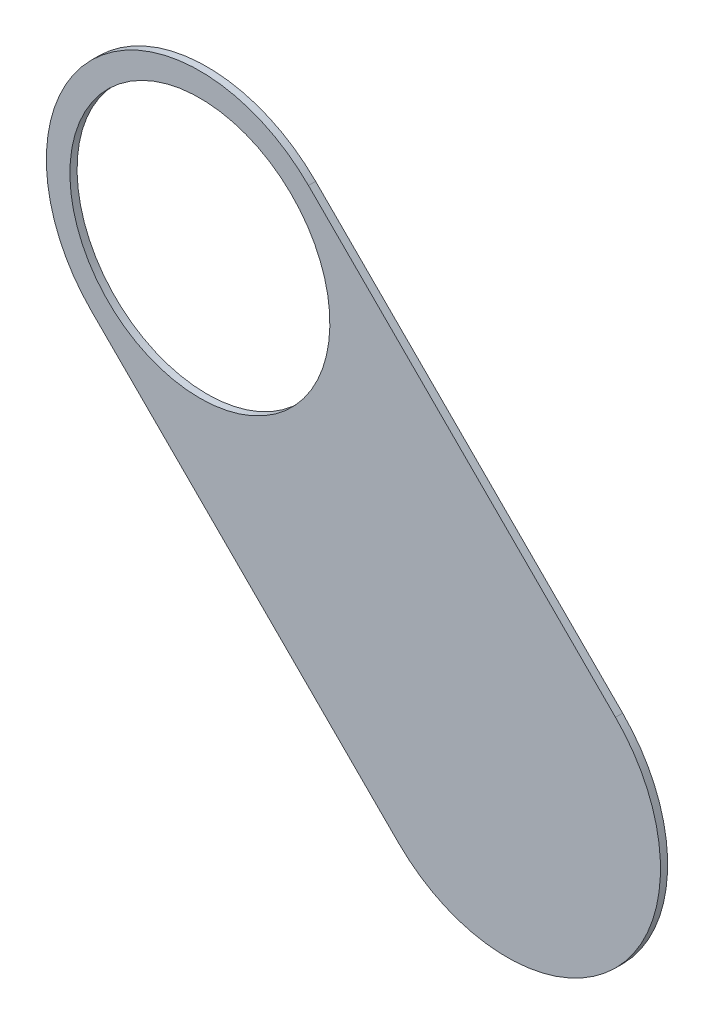
ISO-10303-21;
HEADER;
FILE_DESCRIPTION(('STEP AP214'),'2;1');
FILE_NAME('part.step','',(''),(''),'','','');
FILE_SCHEMA(('AUTOMOTIVE_DESIGN { 1 0 10303 214 1 1 1 1 }'));
ENDSEC;
DATA;
#1=APPLICATION_CONTEXT('core data for automotive mechanical design processes');
#2=APPLICATION_PROTOCOL_DEFINITION('international standard','automotive_design',2000,#1);
#3=PRODUCT_CONTEXT('',#1,'mechanical');
#4=PRODUCT('Part','Part','',(#3));
#5=PRODUCT_RELATED_PRODUCT_CATEGORY('part','',(#4));
#6=PRODUCT_DEFINITION_FORMATION('','',#4);
#7=PRODUCT_DEFINITION_CONTEXT('part definition',#1,'design');
#8=PRODUCT_DEFINITION('design','',#6,#7);
#9=PRODUCT_DEFINITION_SHAPE('','',#8);
#10=(LENGTH_UNIT() NAMED_UNIT(*) SI_UNIT(.MILLI.,.METRE.));
#11=(NAMED_UNIT(*) PLANE_ANGLE_UNIT() SI_UNIT($,.RADIAN.));
#12=(NAMED_UNIT(*) SI_UNIT($,.STERADIAN.) SOLID_ANGLE_UNIT());
#13=UNCERTAINTY_MEASURE_WITH_UNIT(LENGTH_MEASURE(1.E-05),#10,'distance_accuracy_value','');
#14=(GEOMETRIC_REPRESENTATION_CONTEXT(3) GLOBAL_UNCERTAINTY_ASSIGNED_CONTEXT((#13)) GLOBAL_UNIT_ASSIGNED_CONTEXT((#10,
#11,#12)) REPRESENTATION_CONTEXT('',''));
#15=CARTESIAN_POINT('',(0.,0.,0.));
#16=DIRECTION('',(0.,0.,1.));
#17=DIRECTION('',(1.,0.,0.));
#18=AXIS2_PLACEMENT_3D('',#15,#16,#17);
#19=CARTESIAN_POINT('',(-28.25,-7.75,-0.045));
#20=DIRECTION('',(0.,0.,-1.));
#21=DIRECTION('',(0.,-1.,0.));
#22=AXIS2_PLACEMENT_3D('',#19,#20,#21);
#23=CYLINDRICAL_SURFACE('',#22,0.635);
#24=CARTESIAN_POINT('',(-28.25,-7.75,1.6));
#25=DIRECTION('',(0.,0.,-1.));
#26=DIRECTION('',(0.,-1.,0.));
#27=AXIS2_PLACEMENT_3D('',#24,#25,#26);
#28=CIRCLE('',#27,0.635);
#29=CARTESIAN_POINT('',(-28.25,-8.385,1.6));
#30=VERTEX_POINT('',#29);
#31=EDGE_CURVE('E120',#30,#30,#28,.T.);
#32=ORIENTED_EDGE('',*,*,#31,.T.);
#33=DIRECTION('',(0.,0.,1.));
#34=VECTOR('',#33,1.);
#35=CARTESIAN_POINT('',(-28.25,-8.385,-0.045));
#36=LINE('',#35,#34);
#37=CARTESIAN_POINT('',(-28.25,-8.385,1.635));
#38=VERTEX_POINT('',#37);
#39=EDGE_CURVE('E11',#30,#38,#36,.T.);
#40=ORIENTED_EDGE('',*,*,#39,.T.);
#41=CARTESIAN_POINT('',(-28.25,-7.75,1.635));
#42=DIRECTION('',(0.,0.,-1.));
#43=DIRECTION('',(0.,-1.,0.));
#44=AXIS2_PLACEMENT_3D('',#41,#42,#43);
#45=CIRCLE('',#44,0.635);
#46=EDGE_CURVE('E27',#38,#38,#45,.T.);
#47=ORIENTED_EDGE('',*,*,#46,.F.);
#48=ORIENTED_EDGE('',*,*,#39,.F.);
#49=EDGE_LOOP('',(#32,#40,#47,#48));
#50=FACE_BOUND('',#49,.T.);
#51=ADVANCED_FACE('F16',(#50),#23,.F.);
#52=CARTESIAN_POINT('',(-28.78033,-8.28033,1.6));
#53=DIRECTION('',(0.707106781186548,0.707106781186548,0.));
#54=DIRECTION('',(0.,0.,-1.));
#55=AXIS2_PLACEMENT_3D('',#52,#53,#54);
#56=PLANE('',#55);
#57=DIRECTION('',(0.707106781186548,-0.707106781186548,0.));
#58=VECTOR('',#57,1.);
#59=CARTESIAN_POINT('',(-28.78033,-8.28033,1.6));
#60=LINE('',#59,#58);
#61=CARTESIAN_POINT('',(-28.78033,-8.28033,1.6));
#62=VERTEX_POINT('',#61);
#63=CARTESIAN_POINT('',(-27.28033,-9.78033,1.6));
#64=VERTEX_POINT('',#63);
#65=EDGE_CURVE('E20',#62,#64,#60,.T.);
#66=ORIENTED_EDGE('',*,*,#65,.T.);
#67=DIRECTION('',(0.,0.,1.));
#68=VECTOR('',#67,1.);
#69=CARTESIAN_POINT('',(-27.28033,-9.78033,1.6));
#70=LINE('',#69,#68);
#71=CARTESIAN_POINT('',(-27.28033,-9.78033,1.635));
#72=VERTEX_POINT('',#71);
#73=EDGE_CURVE('E95',#64,#72,#70,.T.);
#74=ORIENTED_EDGE('',*,*,#73,.T.);
#75=DIRECTION('',(0.707106781186548,-0.707106781186548,0.));
#76=VECTOR('',#75,1.);
#77=CARTESIAN_POINT('',(-28.78033,-8.28033,1.635));
#78=LINE('',#77,#76);
#79=CARTESIAN_POINT('',(-28.78033,-8.28033,1.635));
#80=VERTEX_POINT('',#79);
#81=EDGE_CURVE('E63',#80,#72,#78,.T.);
#82=ORIENTED_EDGE('',*,*,#81,.F.);
#83=DIRECTION('',(0.,0.,1.));
#84=VECTOR('',#83,1.);
#85=CARTESIAN_POINT('',(-28.78033,-8.28033,1.6));
#86=LINE('',#85,#84);
#87=EDGE_CURVE('E126',#62,#80,#86,.T.);
#88=ORIENTED_EDGE('',*,*,#87,.F.);
#89=EDGE_LOOP('',(#66,#74,#82,#88));
#90=FACE_BOUND('',#89,.T.);
#91=ADVANCED_FACE('F169',(#90),#56,.F.);
#92=CARTESIAN_POINT('',(-26.219669,-8.719669,1.635));
#93=DIRECTION('',(0.,0.,1.));
#94=DIRECTION('',(1.,0.,0.));
#95=AXIS2_PLACEMENT_3D('',#92,#93,#94);
#96=PLANE('',#95);
#97=ORIENTED_EDGE('',*,*,#46,.T.);
#98=EDGE_LOOP('',(#97));
#99=FACE_BOUND('',#98,.T.);
#100=DIRECTION('',(-0.707106781186548,0.707106781186548,0.));
#101=VECTOR('',#100,1.);
#102=CARTESIAN_POINT('',(-26.219669,-8.719669,1.635));
#103=LINE('',#102,#101);
#104=CARTESIAN_POINT('',(-26.219669,-8.719669,1.635));
#105=VERTEX_POINT('',#104);
#106=CARTESIAN_POINT('',(-27.719669,-7.219669,1.635));
#107=VERTEX_POINT('',#106);
#108=EDGE_CURVE('E104',#105,#107,#103,.T.);
#109=ORIENTED_EDGE('',*,*,#108,.T.);
#110=CARTESIAN_POINT('',(-28.2499995,-7.7499995,1.635));
#111=DIRECTION('',(0.,0.,1.));
#112=DIRECTION('',(0.707106781186548,0.707106781186548,0.));
#113=AXIS2_PLACEMENT_3D('',#110,#111,#112);
#114=CIRCLE('',#113,0.75000058564);
#115=EDGE_CURVE('E124',#107,#80,#114,.T.);
#116=ORIENTED_EDGE('',*,*,#115,.T.);
#117=ORIENTED_EDGE('',*,*,#81,.T.);
#118=CARTESIAN_POINT('',(-26.7499995,-9.2499995,1.635));
#119=DIRECTION('',(0.,0.,1.));
#120=DIRECTION('',(-0.707106781186548,-0.707106781186548,0.));
#121=AXIS2_PLACEMENT_3D('',#118,#119,#120);
#122=CIRCLE('',#121,0.75000058564);
#123=EDGE_CURVE('E97',#72,#105,#122,.T.);
#124=ORIENTED_EDGE('',*,*,#123,.T.);
#125=EDGE_LOOP('',(#109,#116,#117,#124));
#126=FACE_BOUND('',#125,.T.);
#127=ADVANCED_FACE('F144',(#99,#126),#96,.T.);
#128=CARTESIAN_POINT('',(-26.219669,-8.719669,1.6));
#129=DIRECTION('',(0.,0.,1.));
#130=DIRECTION('',(1.,0.,0.));
#131=AXIS2_PLACEMENT_3D('',#128,#129,#130);
#132=PLANE('',#131);
#133=ORIENTED_EDGE('',*,*,#31,.F.);
#134=EDGE_LOOP('',(#133));
#135=FACE_BOUND('',#134,.T.);
#136=CARTESIAN_POINT('',(-26.7499995,-9.2499995,1.6));
#137=DIRECTION('',(0.,0.,1.));
#138=DIRECTION('',(-0.707106781186548,-0.707106781186548,0.));
#139=AXIS2_PLACEMENT_3D('',#136,#137,#138);
#140=CIRCLE('',#139,0.75000058564);
#141=CARTESIAN_POINT('',(-26.219669,-8.719669,1.6));
#142=VERTEX_POINT('',#141);
#143=EDGE_CURVE('E89',#64,#142,#140,.T.);
#144=ORIENTED_EDGE('',*,*,#143,.F.);
#145=ORIENTED_EDGE('',*,*,#65,.F.);
#146=CARTESIAN_POINT('',(-28.2499995,-7.7499995,1.6));
#147=DIRECTION('',(0.,0.,1.));
#148=DIRECTION('',(0.707106781186548,0.707106781186548,0.));
#149=AXIS2_PLACEMENT_3D('',#146,#147,#148);
#150=CIRCLE('',#149,0.75000058564);
#151=CARTESIAN_POINT('',(-27.719669,-7.219669,1.6));
#152=VERTEX_POINT('',#151);
#153=EDGE_CURVE('E80',#152,#62,#150,.T.);
#154=ORIENTED_EDGE('',*,*,#153,.F.);
#155=DIRECTION('',(-0.707106781186548,0.707106781186548,0.));
#156=VECTOR('',#155,1.);
#157=CARTESIAN_POINT('',(-26.219669,-8.719669,1.6));
#158=LINE('',#157,#156);
#159=EDGE_CURVE('E102',#142,#152,#158,.T.);
#160=ORIENTED_EDGE('',*,*,#159,.F.);
#161=EDGE_LOOP('',(#144,#145,#154,#160));
#162=FACE_BOUND('',#161,.T.);
#163=ADVANCED_FACE('F107',(#135,#162),#132,.F.);
#164=CARTESIAN_POINT('',(-28.2499995,-7.7499995,1.6));
#165=DIRECTION('',(0.,0.,-1.));
#166=DIRECTION('',(0.707106781186548,0.707106781186548,0.));
#167=AXIS2_PLACEMENT_3D('',#164,#165,#166);
#168=CYLINDRICAL_SURFACE('',#167,0.75000058564);
#169=ORIENTED_EDGE('',*,*,#153,.T.);
#170=ORIENTED_EDGE('',*,*,#87,.T.);
#171=ORIENTED_EDGE('',*,*,#115,.F.);
#172=DIRECTION('',(0.,0.,1.));
#173=VECTOR('',#172,1.);
#174=CARTESIAN_POINT('',(-27.719669,-7.219669,1.6));
#175=LINE('',#174,#173);
#176=EDGE_CURVE('E109',#152,#107,#175,.T.);
#177=ORIENTED_EDGE('',*,*,#176,.F.);
#178=EDGE_LOOP('',(#169,#170,#171,#177));
#179=FACE_BOUND('',#178,.T.);
#180=ADVANCED_FACE('F178',(#179),#168,.T.);
#181=CARTESIAN_POINT('',(-26.7499995,-9.2499995,1.6));
#182=DIRECTION('',(0.,0.,-1.));
#183=DIRECTION('',(-0.707106781186548,-0.707106781186548,0.));
#184=AXIS2_PLACEMENT_3D('',#181,#182,#183);
#185=CYLINDRICAL_SURFACE('',#184,0.75000058564);
#186=ORIENTED_EDGE('',*,*,#143,.T.);
#187=DIRECTION('',(0.,0.,1.));
#188=VECTOR('',#187,1.);
#189=CARTESIAN_POINT('',(-26.219669,-8.719669,1.6));
#190=LINE('',#189,#188);
#191=EDGE_CURVE('E93',#142,#105,#190,.T.);
#192=ORIENTED_EDGE('',*,*,#191,.T.);
#193=ORIENTED_EDGE('',*,*,#123,.F.);
#194=ORIENTED_EDGE('',*,*,#73,.F.);
#195=EDGE_LOOP('',(#186,#192,#193,#194));
#196=FACE_BOUND('',#195,.T.);
#197=ADVANCED_FACE('F91',(#196),#185,.T.);
#198=CARTESIAN_POINT('',(-26.219669,-8.719669,1.6));
#199=DIRECTION('',(-0.707106781186548,-0.707106781186548,0.));
#200=DIRECTION('',(-0.707106781186548,0.707106781186548,0.));
#201=AXIS2_PLACEMENT_3D('',#198,#199,#200);
#202=PLANE('',#201);
#203=ORIENTED_EDGE('',*,*,#159,.T.);
#204=ORIENTED_EDGE('',*,*,#176,.T.);
#205=ORIENTED_EDGE('',*,*,#108,.F.);
#206=ORIENTED_EDGE('',*,*,#191,.F.);
#207=EDGE_LOOP('',(#203,#204,#205,#206));
#208=FACE_BOUND('',#207,.T.);
#209=ADVANCED_FACE('F18',(#208),#202,.F.);
#210=CLOSED_SHELL('',(#51,#91,#127,#163,#180,#197,#209));
#211=MANIFOLD_SOLID_BREP('B1',#210);
#212=ADVANCED_BREP_SHAPE_REPRESENTATION('',(#18,#211),#14);
#213=SHAPE_DEFINITION_REPRESENTATION(#9,#212);
ENDSEC;
END-ISO-10303-21;
